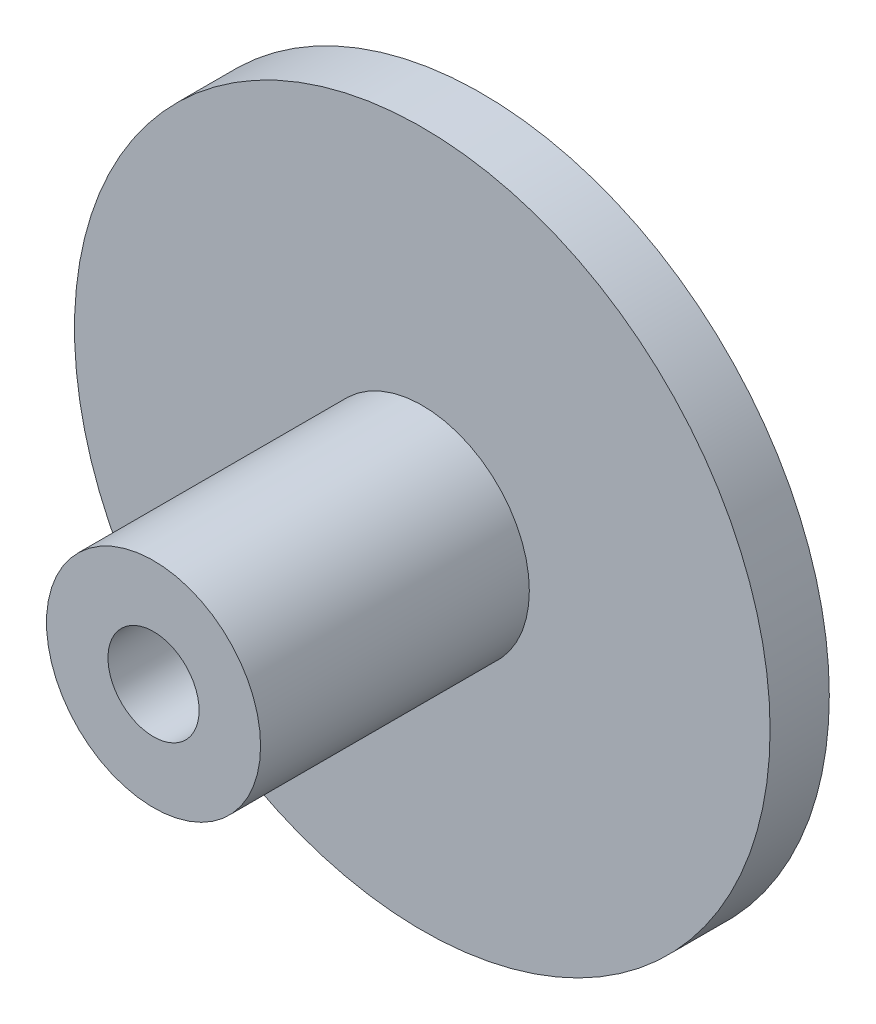
ISO-10303-21;
HEADER;
FILE_DESCRIPTION(('STEP AP214'),'2;1');
FILE_NAME('part.step','',(''),(''),'','','');
FILE_SCHEMA(('AUTOMOTIVE_DESIGN { 1 0 10303 214 1 1 1 1 }'));
ENDSEC;
DATA;
#1=APPLICATION_CONTEXT('core data for automotive mechanical design processes');
#2=APPLICATION_PROTOCOL_DEFINITION('international standard','automotive_design',2000,#1);
#3=PRODUCT_CONTEXT('',#1,'mechanical');
#4=PRODUCT('Part','Part','',(#3));
#5=PRODUCT_RELATED_PRODUCT_CATEGORY('part','',(#4));
#6=PRODUCT_DEFINITION_FORMATION('','',#4);
#7=PRODUCT_DEFINITION_CONTEXT('part definition',#1,'design');
#8=PRODUCT_DEFINITION('design','',#6,#7);
#9=PRODUCT_DEFINITION_SHAPE('','',#8);
#10=(LENGTH_UNIT() NAMED_UNIT(*) SI_UNIT(.MILLI.,.METRE.));
#11=(NAMED_UNIT(*) PLANE_ANGLE_UNIT() SI_UNIT($,.RADIAN.));
#12=(NAMED_UNIT(*) SI_UNIT($,.STERADIAN.) SOLID_ANGLE_UNIT());
#13=UNCERTAINTY_MEASURE_WITH_UNIT(LENGTH_MEASURE(1.E-05),#10,'distance_accuracy_value','');
#14=(GEOMETRIC_REPRESENTATION_CONTEXT(3) GLOBAL_UNCERTAINTY_ASSIGNED_CONTEXT((#13)) GLOBAL_UNIT_ASSIGNED_CONTEXT((#10,
#11,#12)) REPRESENTATION_CONTEXT('',''));
#15=CARTESIAN_POINT('',(0.,0.,0.));
#16=DIRECTION('',(0.,0.,1.));
#17=DIRECTION('',(1.,0.,0.));
#18=AXIS2_PLACEMENT_3D('',#15,#16,#17);
#19=CARTESIAN_POINT('',(0.,0.,1.3));
#20=DIRECTION('',(0.,0.,1.));
#21=DIRECTION('',(1.,0.,0.));
#22=AXIS2_PLACEMENT_3D('',#19,#20,#21);
#23=PLANE('',#22);
#24=CARTESIAN_POINT('',(0.,0.,1.3));
#25=DIRECTION('',(0.,0.,1.));
#26=DIRECTION('',(1.,0.,0.));
#27=AXIS2_PLACEMENT_3D('',#24,#25,#26);
#28=CIRCLE('',#27,7.635);
#29=CARTESIAN_POINT('',(7.635,0.,1.3));
#30=VERTEX_POINT('',#29);
#31=EDGE_CURVE('E10',#30,#30,#28,.T.);
#32=ORIENTED_EDGE('',*,*,#31,.T.);
#33=EDGE_LOOP('',(#32));
#34=FACE_BOUND('',#33,.T.);
#35=CARTESIAN_POINT('',(0.,0.,1.3));
#36=DIRECTION('',(0.,0.,1.));
#37=DIRECTION('',(1.,0.,0.));
#38=AXIS2_PLACEMENT_3D('',#35,#36,#37);
#39=CIRCLE('',#38,2.35);
#40=CARTESIAN_POINT('',(2.35,0.,1.3));
#41=VERTEX_POINT('',#40);
#42=EDGE_CURVE('E55',#41,#41,#39,.T.);
#43=ORIENTED_EDGE('',*,*,#42,.F.);
#44=EDGE_LOOP('',(#43));
#45=FACE_BOUND('',#44,.T.);
#46=ADVANCED_FACE('F39',(#34,#45),#23,.T.);
#47=CARTESIAN_POINT('',(0.,0.,0.));
#48=DIRECTION('',(0.,0.,1.));
#49=DIRECTION('',(1.,0.,0.));
#50=AXIS2_PLACEMENT_3D('',#47,#48,#49);
#51=PLANE('',#50);
#52=CARTESIAN_POINT('',(0.,0.,0.));
#53=DIRECTION('',(0.,0.,1.));
#54=DIRECTION('',(1.,0.,0.));
#55=AXIS2_PLACEMENT_3D('',#52,#53,#54);
#56=CIRCLE('',#55,7.635);
#57=CARTESIAN_POINT('',(7.635,0.,0.));
#58=VERTEX_POINT('',#57);
#59=EDGE_CURVE('E43',#58,#58,#56,.T.);
#60=ORIENTED_EDGE('',*,*,#59,.F.);
#61=EDGE_LOOP('',(#60));
#62=FACE_BOUND('',#61,.T.);
#63=CARTESIAN_POINT('',(0.,0.,0.));
#64=DIRECTION('',(0.,0.,1.));
#65=DIRECTION('',(1.,0.,0.));
#66=AXIS2_PLACEMENT_3D('',#63,#64,#65);
#67=CIRCLE('',#66,1.);
#68=CARTESIAN_POINT('',(1.,0.,0.));
#69=VERTEX_POINT('',#68);
#70=EDGE_CURVE('E50',#69,#69,#67,.T.);
#71=ORIENTED_EDGE('',*,*,#70,.T.);
#72=EDGE_LOOP('',(#71));
#73=FACE_BOUND('',#72,.T.);
#74=ADVANCED_FACE('F80',(#62,#73),#51,.F.);
#75=CARTESIAN_POINT('',(0.,0.,1.3));
#76=DIRECTION('',(0.,0.,-1.));
#77=DIRECTION('',(-1.,0.,0.));
#78=AXIS2_PLACEMENT_3D('',#75,#76,#77);
#79=CYLINDRICAL_SURFACE('',#78,7.635);
#80=ORIENTED_EDGE('',*,*,#31,.F.);
#81=EDGE_LOOP('',(#80));
#82=FACE_BOUND('',#81,.T.);
#83=ORIENTED_EDGE('',*,*,#59,.T.);
#84=EDGE_LOOP('',(#83));
#85=FACE_BOUND('',#84,.T.);
#86=ADVANCED_FACE('F41',(#82,#85),#79,.T.);
#87=CARTESIAN_POINT('',(0.,0.,1.3));
#88=DIRECTION('',(0.,0.,-1.));
#89=DIRECTION('',(-1.,0.,0.));
#90=AXIS2_PLACEMENT_3D('',#87,#88,#89);
#91=CYLINDRICAL_SURFACE('',#90,1.);
#92=ORIENTED_EDGE('',*,*,#70,.F.);
#93=EDGE_LOOP('',(#92));
#94=FACE_BOUND('',#93,.T.);
#95=CARTESIAN_POINT('',(0.,0.,7.2));
#96=DIRECTION('',(0.,0.,1.));
#97=DIRECTION('',(1.,0.,0.));
#98=AXIS2_PLACEMENT_3D('',#95,#96,#97);
#99=CIRCLE('',#98,1.);
#100=CARTESIAN_POINT('',(1.,0.,7.2));
#101=VERTEX_POINT('',#100);
#102=EDGE_CURVE('E58',#101,#101,#99,.T.);
#103=ORIENTED_EDGE('',*,*,#102,.T.);
#104=EDGE_LOOP('',(#103));
#105=FACE_BOUND('',#104,.T.);
#106=ADVANCED_FACE('F64',(#94,#105),#91,.F.);
#107=CARTESIAN_POINT('',(0.,0.,7.2));
#108=DIRECTION('',(0.,0.,1.));
#109=DIRECTION('',(1.,0.,0.));
#110=AXIS2_PLACEMENT_3D('',#107,#108,#109);
#111=PLANE('',#110);
#112=CARTESIAN_POINT('',(0.,0.,7.2));
#113=DIRECTION('',(0.,0.,1.));
#114=DIRECTION('',(1.,0.,0.));
#115=AXIS2_PLACEMENT_3D('',#112,#113,#114);
#116=CIRCLE('',#115,2.35);
#117=CARTESIAN_POINT('',(2.35,0.,7.2));
#118=VERTEX_POINT('',#117);
#119=EDGE_CURVE('E54',#118,#118,#116,.T.);
#120=ORIENTED_EDGE('',*,*,#119,.T.);
#121=EDGE_LOOP('',(#120));
#122=FACE_BOUND('',#121,.T.);
#123=ORIENTED_EDGE('',*,*,#102,.F.);
#124=EDGE_LOOP('',(#123));
#125=FACE_BOUND('',#124,.T.);
#126=ADVANCED_FACE('F66',(#122,#125),#111,.T.);
#127=CARTESIAN_POINT('',(0.,0.,7.2));
#128=DIRECTION('',(0.,0.,-1.));
#129=DIRECTION('',(-1.,0.,0.));
#130=AXIS2_PLACEMENT_3D('',#127,#128,#129);
#131=CYLINDRICAL_SURFACE('',#130,2.35);
#132=ORIENTED_EDGE('',*,*,#119,.F.);
#133=EDGE_LOOP('',(#132));
#134=FACE_BOUND('',#133,.T.);
#135=ORIENTED_EDGE('',*,*,#42,.T.);
#136=EDGE_LOOP('',(#135));
#137=FACE_BOUND('',#136,.T.);
#138=ADVANCED_FACE('F68',(#134,#137),#131,.T.);
#139=CLOSED_SHELL('',(#46,#74,#86,#106,#126,#138));
#140=MANIFOLD_SOLID_BREP('B2',#139);
#141=ADVANCED_BREP_SHAPE_REPRESENTATION('',(#18,#140),#14);
#142=SHAPE_DEFINITION_REPRESENTATION(#9,#141);
ENDSEC;
END-ISO-10303-21;
